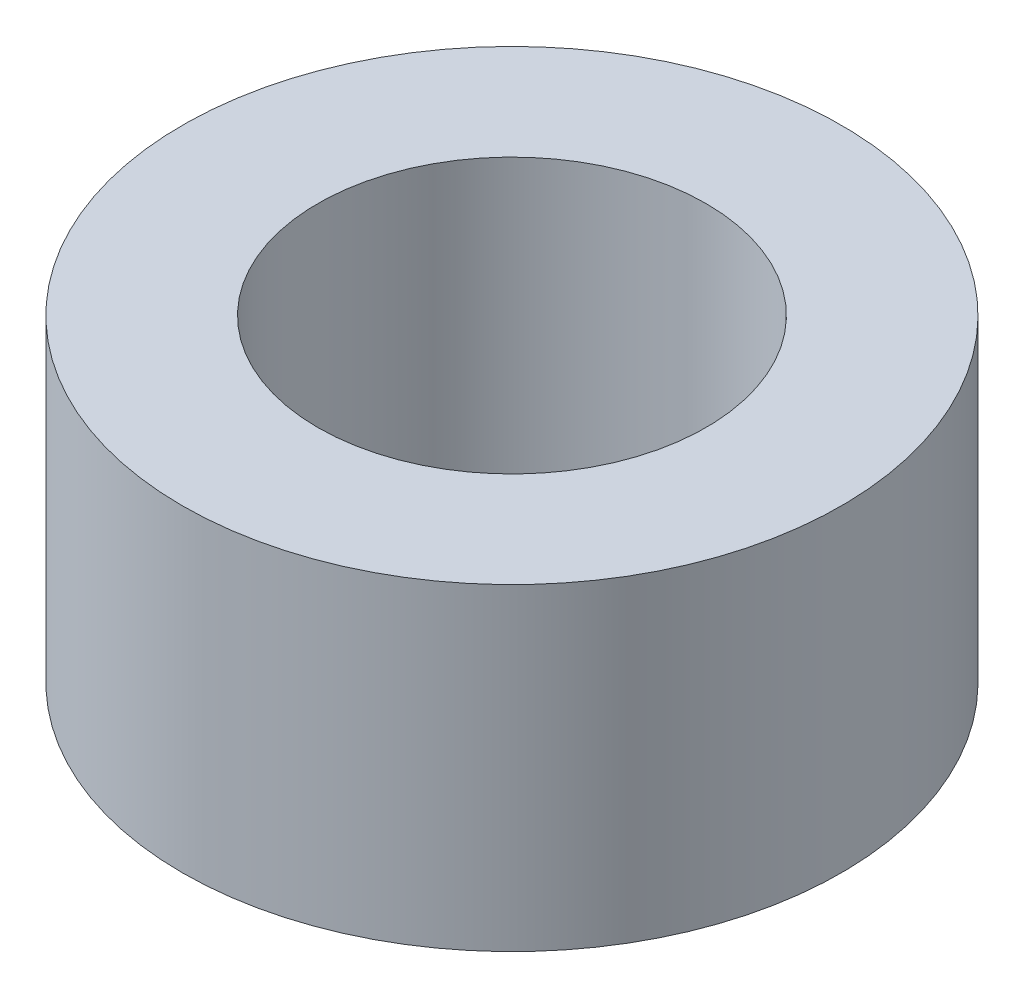
ISO-10303-21;
HEADER;
FILE_DESCRIPTION(('STEP AP214'),'2;1');
FILE_NAME('part.step','',(''),(''),'','','');
FILE_SCHEMA(('AUTOMOTIVE_DESIGN { 1 0 10303 214 1 1 1 1 }'));
ENDSEC;
DATA;
#1=APPLICATION_CONTEXT('core data for automotive mechanical design processes');
#2=APPLICATION_PROTOCOL_DEFINITION('international standard','automotive_design',2000,#1);
#3=PRODUCT_CONTEXT('',#1,'mechanical');
#4=PRODUCT('Part','Part','',(#3));
#5=PRODUCT_RELATED_PRODUCT_CATEGORY('part','',(#4));
#6=PRODUCT_DEFINITION_FORMATION('','',#4);
#7=PRODUCT_DEFINITION_CONTEXT('part definition',#1,'design');
#8=PRODUCT_DEFINITION('design','',#6,#7);
#9=PRODUCT_DEFINITION_SHAPE('','',#8);
#10=(LENGTH_UNIT() NAMED_UNIT(*) SI_UNIT(.MILLI.,.METRE.));
#11=(NAMED_UNIT(*) PLANE_ANGLE_UNIT() SI_UNIT($,.RADIAN.));
#12=(NAMED_UNIT(*) SI_UNIT($,.STERADIAN.) SOLID_ANGLE_UNIT());
#13=UNCERTAINTY_MEASURE_WITH_UNIT(LENGTH_MEASURE(1.E-05),#10,'distance_accuracy_value','');
#14=(GEOMETRIC_REPRESENTATION_CONTEXT(3) GLOBAL_UNCERTAINTY_ASSIGNED_CONTEXT((#13)) GLOBAL_UNIT_ASSIGNED_CONTEXT((#10,
#11,#12)) REPRESENTATION_CONTEXT('',''));
#15=CARTESIAN_POINT('',(0.,0.,0.));
#16=DIRECTION('',(0.,0.,1.));
#17=DIRECTION('',(1.,0.,0.));
#18=AXIS2_PLACEMENT_3D('',#15,#16,#17);
#19=CARTESIAN_POINT('',(0.,5.5118,0.));
#20=DIRECTION('',(0.,1.,0.));
#21=DIRECTION('',(0.,0.,1.));
#22=AXIS2_PLACEMENT_3D('',#19,#20,#21);
#23=PLANE('',#22);
#24=CARTESIAN_POINT('',(0.,5.5118,0.));
#25=DIRECTION('',(0.,1.,0.));
#26=DIRECTION('',(0.,0.,1.));
#27=AXIS2_PLACEMENT_3D('',#24,#25,#26);
#28=CIRCLE('',#27,5.715);
#29=CARTESIAN_POINT('',(0.,5.5118,5.715));
#30=VERTEX_POINT('',#29);
#31=EDGE_CURVE('E10',#30,#30,#28,.T.);
#32=ORIENTED_EDGE('',*,*,#31,.T.);
#33=EDGE_LOOP('',(#32));
#34=FACE_BOUND('',#33,.T.);
#35=CARTESIAN_POINT('',(0.,5.5118,0.));
#36=DIRECTION('',(0.,1.,0.));
#37=DIRECTION('',(0.,0.,1.));
#38=AXIS2_PLACEMENT_3D('',#35,#36,#37);
#39=CIRCLE('',#38,3.3655);
#40=CARTESIAN_POINT('',(0.,5.5118,3.3655));
#41=VERTEX_POINT('',#40);
#42=EDGE_CURVE('E48',#41,#41,#39,.T.);
#43=ORIENTED_EDGE('',*,*,#42,.F.);
#44=EDGE_LOOP('',(#43));
#45=FACE_BOUND('',#44,.T.);
#46=ADVANCED_FACE('F37',(#34,#45),#23,.T.);
#47=CARTESIAN_POINT('',(0.,0.,0.));
#48=DIRECTION('',(0.,1.,0.));
#49=DIRECTION('',(0.,0.,1.));
#50=AXIS2_PLACEMENT_3D('',#47,#48,#49);
#51=PLANE('',#50);
#52=CARTESIAN_POINT('',(0.,0.,0.));
#53=DIRECTION('',(0.,1.,0.));
#54=DIRECTION('',(0.,0.,1.));
#55=AXIS2_PLACEMENT_3D('',#52,#53,#54);
#56=CIRCLE('',#55,5.715);
#57=CARTESIAN_POINT('',(0.,0.,5.715));
#58=VERTEX_POINT('',#57);
#59=EDGE_CURVE('E41',#58,#58,#56,.T.);
#60=ORIENTED_EDGE('',*,*,#59,.F.);
#61=EDGE_LOOP('',(#60));
#62=FACE_BOUND('',#61,.T.);
#63=CARTESIAN_POINT('',(0.,0.,0.));
#64=DIRECTION('',(0.,1.,0.));
#65=DIRECTION('',(0.,0.,1.));
#66=AXIS2_PLACEMENT_3D('',#63,#64,#65);
#67=CIRCLE('',#66,3.3655);
#68=CARTESIAN_POINT('',(0.,0.,3.3655));
#69=VERTEX_POINT('',#68);
#70=EDGE_CURVE('E50',#69,#69,#67,.T.);
#71=ORIENTED_EDGE('',*,*,#70,.T.);
#72=EDGE_LOOP('',(#71));
#73=FACE_BOUND('',#72,.T.);
#74=ADVANCED_FACE('F60',(#62,#73),#51,.F.);
#75=CARTESIAN_POINT('',(0.,5.5118,0.));
#76=DIRECTION('',(0.,-1.,0.));
#77=DIRECTION('',(0.,0.,-1.));
#78=AXIS2_PLACEMENT_3D('',#75,#76,#77);
#79=CYLINDRICAL_SURFACE('',#78,5.715);
#80=ORIENTED_EDGE('',*,*,#31,.F.);
#81=EDGE_LOOP('',(#80));
#82=FACE_BOUND('',#81,.T.);
#83=ORIENTED_EDGE('',*,*,#59,.T.);
#84=EDGE_LOOP('',(#83));
#85=FACE_BOUND('',#84,.T.);
#86=ADVANCED_FACE('F39',(#82,#85),#79,.T.);
#87=CARTESIAN_POINT('',(0.,5.5118,0.));
#88=DIRECTION('',(0.,-1.,0.));
#89=DIRECTION('',(0.,0.,-1.));
#90=AXIS2_PLACEMENT_3D('',#87,#88,#89);
#91=CYLINDRICAL_SURFACE('',#90,3.3655);
#92=ORIENTED_EDGE('',*,*,#42,.T.);
#93=EDGE_LOOP('',(#92));
#94=FACE_BOUND('',#93,.T.);
#95=ORIENTED_EDGE('',*,*,#70,.F.);
#96=EDGE_LOOP('',(#95));
#97=FACE_BOUND('',#96,.T.);
#98=ADVANCED_FACE('F56',(#94,#97),#91,.F.);
#99=CLOSED_SHELL('',(#46,#74,#86,#98));
#100=MANIFOLD_SOLID_BREP('B2',#99);
#101=ADVANCED_BREP_SHAPE_REPRESENTATION('',(#18,#100),#14);
#102=SHAPE_DEFINITION_REPRESENTATION(#9,#101);
ENDSEC;
END-ISO-10303-21;
